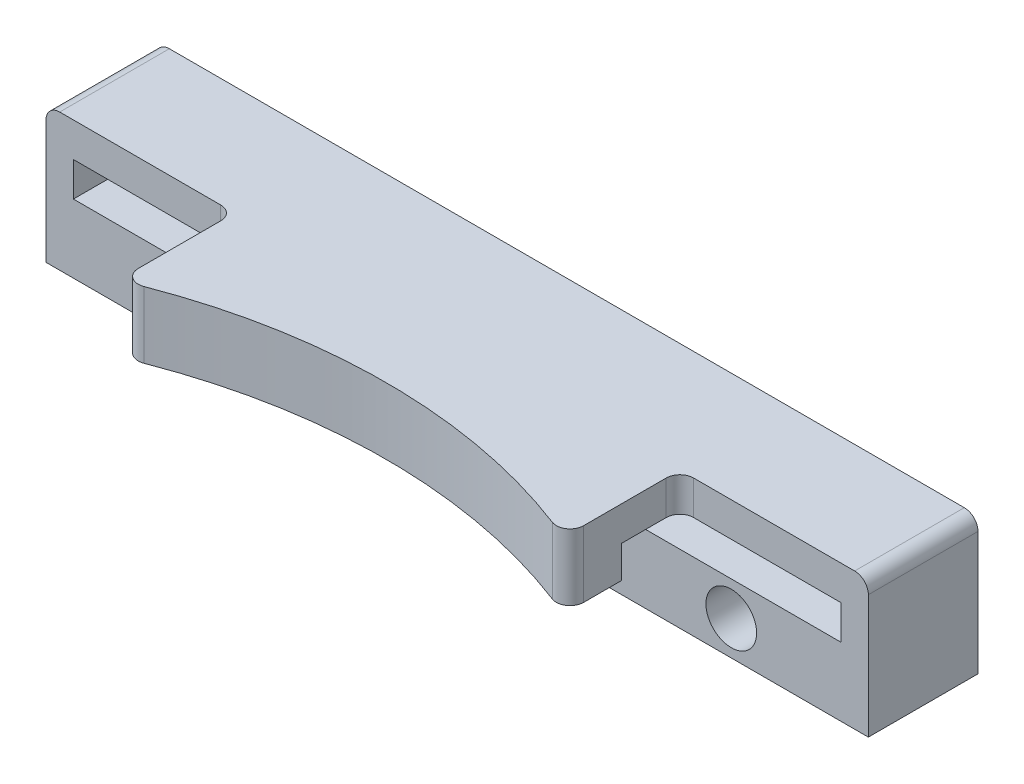
ISO-10303-21;
HEADER;
FILE_DESCRIPTION(('STEP AP214'),'2;1');
FILE_NAME('part.step','',(''),(''),'','','');
FILE_SCHEMA(('AUTOMOTIVE_DESIGN { 1 0 10303 214 1 1 1 1 }'));
ENDSEC;
DATA;
#1=APPLICATION_CONTEXT('core data for automotive mechanical design processes');
#2=APPLICATION_PROTOCOL_DEFINITION('international standard','automotive_design',2000,#1);
#3=PRODUCT_CONTEXT('',#1,'mechanical');
#4=PRODUCT('Part','Part','',(#3));
#5=PRODUCT_RELATED_PRODUCT_CATEGORY('part','',(#4));
#6=PRODUCT_DEFINITION_FORMATION('','',#4);
#7=PRODUCT_DEFINITION_CONTEXT('part definition',#1,'design');
#8=PRODUCT_DEFINITION('design','',#6,#7);
#9=PRODUCT_DEFINITION_SHAPE('','',#8);
#10=(LENGTH_UNIT() NAMED_UNIT(*) SI_UNIT(.MILLI.,.METRE.));
#11=(NAMED_UNIT(*) PLANE_ANGLE_UNIT() SI_UNIT($,.RADIAN.));
#12=(NAMED_UNIT(*) SI_UNIT($,.STERADIAN.) SOLID_ANGLE_UNIT());
#13=UNCERTAINTY_MEASURE_WITH_UNIT(LENGTH_MEASURE(1.E-05),#10,'distance_accuracy_value','');
#14=(GEOMETRIC_REPRESENTATION_CONTEXT(3) GLOBAL_UNCERTAINTY_ASSIGNED_CONTEXT((#13)) GLOBAL_UNIT_ASSIGNED_CONTEXT((#10,
#11,#12)) REPRESENTATION_CONTEXT('',''));
#15=CARTESIAN_POINT('',(0.,0.,0.));
#16=DIRECTION('',(0.,0.,1.));
#17=DIRECTION('',(1.,0.,0.));
#18=AXIS2_PLACEMENT_3D('',#15,#16,#17);
#19=CARTESIAN_POINT('',(-56.,15.,16.));
#20=DIRECTION('',(0.,-1.,0.));
#21=DIRECTION('',(0.,0.,-1.));
#22=AXIS2_PLACEMENT_3D('',#19,#20,#21);
#23=PLANE('',#22);
#24=DIRECTION('',(0.,0.,-1.));
#25=VECTOR('',#24,1.);
#26=CARTESIAN_POINT('',(32.5,15.,16.));
#27=LINE('',#26,#25);
#28=CARTESIAN_POINT('',(32.5,15.,24.52));
#29=VERTEX_POINT('',#28);
#30=CARTESIAN_POINT('',(32.5,15.,18.));
#31=VERTEX_POINT('',#30);
#32=EDGE_CURVE('E212',#29,#31,#27,.T.);
#33=ORIENTED_EDGE('',*,*,#32,.F.);
#34=CARTESIAN_POINT('',(0.,15.,100.892442674043));
#35=DIRECTION('',(0.,-1.,0.));
#36=DIRECTION('',(0.,0.,-1.));
#37=AXIS2_PLACEMENT_3D('',#34,#35,#36);
#38=CIRCLE('',#37,83.);
#39=CARTESIAN_POINT('',(-32.5,15.,24.52));
#40=VERTEX_POINT('',#39);
#41=EDGE_CURVE('E206',#40,#29,#38,.T.);
#42=ORIENTED_EDGE('',*,*,#41,.F.);
#43=DIRECTION('',(0.,0.,1.));
#44=VECTOR('',#43,1.);
#45=CARTESIAN_POINT('',(-32.5,15.,33.));
#46=LINE('',#45,#44);
#47=CARTESIAN_POINT('',(-32.5,15.,18.));
#48=VERTEX_POINT('',#47);
#49=EDGE_CURVE('E192',#48,#40,#46,.T.);
#50=ORIENTED_EDGE('',*,*,#49,.F.);
#51=CARTESIAN_POINT('',(-34.5,15.,18.));
#52=DIRECTION('',(0.,-1.,0.));
#53=DIRECTION('',(0.,0.,-1.));
#54=AXIS2_PLACEMENT_3D('',#51,#52,#53);
#55=CIRCLE('',#54,2.);
#56=CARTESIAN_POINT('',(-34.5,15.,16.));
#57=VERTEX_POINT('',#56);
#58=EDGE_CURVE('E11',#48,#57,#55,.F.);
#59=ORIENTED_EDGE('',*,*,#58,.T.);
#60=DIRECTION('',(-1.,0.,0.));
#61=VECTOR('',#60,1.);
#62=CARTESIAN_POINT('',(-56.,15.,16.));
#63=LINE('',#62,#61);
#64=CARTESIAN_POINT('',(-56.,15.,16.));
#65=VERTEX_POINT('',#64);
#66=EDGE_CURVE('E250',#57,#65,#63,.T.);
#67=ORIENTED_EDGE('',*,*,#66,.T.);
#68=DIRECTION('',(0.,0.,-1.));
#69=VECTOR('',#68,1.);
#70=CARTESIAN_POINT('',(-56.,15.,16.));
#71=LINE('',#70,#69);
#72=CARTESIAN_POINT('',(-56.,15.,0.));
#73=VERTEX_POINT('',#72);
#74=EDGE_CURVE('E254',#65,#73,#71,.T.);
#75=ORIENTED_EDGE('',*,*,#74,.T.);
#76=DIRECTION('',(-1.,0.,0.));
#77=VECTOR('',#76,1.);
#78=CARTESIAN_POINT('',(-56.,15.,0.));
#79=LINE('',#78,#77);
#80=CARTESIAN_POINT('',(56.,15.,0.));
#81=VERTEX_POINT('',#80);
#82=EDGE_CURVE('E245',#81,#73,#79,.T.);
#83=ORIENTED_EDGE('',*,*,#82,.F.);
#84=DIRECTION('',(0.,0.,-1.));
#85=VECTOR('',#84,1.);
#86=CARTESIAN_POINT('',(56.,15.,16.));
#87=LINE('',#86,#85);
#88=CARTESIAN_POINT('',(56.,15.,16.));
#89=VERTEX_POINT('',#88);
#90=EDGE_CURVE('E267',#89,#81,#87,.T.);
#91=ORIENTED_EDGE('',*,*,#90,.F.);
#92=CARTESIAN_POINT('',(34.5,15.,16.));
#93=VERTEX_POINT('',#92);
#94=EDGE_CURVE('E251',#89,#93,#63,.T.);
#95=ORIENTED_EDGE('',*,*,#94,.T.);
#96=CARTESIAN_POINT('',(34.5,15.,18.));
#97=DIRECTION('',(0.,-1.,0.));
#98=DIRECTION('',(0.,0.,-1.));
#99=AXIS2_PLACEMENT_3D('',#96,#97,#98);
#100=CIRCLE('',#99,2.);
#101=EDGE_CURVE('E349',#93,#31,#100,.F.);
#102=ORIENTED_EDGE('',*,*,#101,.T.);
#103=EDGE_LOOP('',(#33,#42,#50,#59,#67,#75,#83,#91,#95,#102));
#104=FACE_BOUND('',#103,.T.);
#105=ADVANCED_FACE('F38',(#104),#23,.T.);
#106=CARTESIAN_POINT('',(-40.,5.,16.));
#107=DIRECTION('',(0.,0.,-1.));
#108=DIRECTION('',(-1.,0.,0.));
#109=AXIS2_PLACEMENT_3D('',#106,#107,#108);
#110=CYLINDRICAL_SURFACE('',#109,2.);
#111=CARTESIAN_POINT('',(-40.,5.,0.));
#112=DIRECTION('',(0.,0.,1.));
#113=DIRECTION('',(1.,0.,0.));
#114=AXIS2_PLACEMENT_3D('',#111,#112,#113);
#115=CIRCLE('',#114,2.);
#116=CARTESIAN_POINT('',(-38.,5.,0.));
#117=VERTEX_POINT('',#116);
#118=EDGE_CURVE('E237',#117,#117,#115,.T.);
#119=ORIENTED_EDGE('',*,*,#118,.F.);
#120=EDGE_LOOP('',(#119));
#121=FACE_BOUND('',#120,.T.);
#122=CARTESIAN_POINT('',(-40.,5.,8.));
#123=DIRECTION('',(0.,0.,1.));
#124=DIRECTION('',(1.,0.,0.));
#125=AXIS2_PLACEMENT_3D('',#122,#123,#124);
#126=CIRCLE('',#125,2.);
#127=CARTESIAN_POINT('',(-38.,5.,8.));
#128=VERTEX_POINT('',#127);
#129=EDGE_CURVE('E238',#128,#128,#126,.T.);
#130=ORIENTED_EDGE('',*,*,#129,.T.);
#131=EDGE_LOOP('',(#130));
#132=FACE_BOUND('',#131,.T.);
#133=ADVANCED_FACE('F405',(#121,#132),#110,.F.);
#134=CARTESIAN_POINT('',(40.,5.,16.));
#135=DIRECTION('',(0.,0.,-1.));
#136=DIRECTION('',(-1.,0.,0.));
#137=AXIS2_PLACEMENT_3D('',#134,#135,#136);
#138=CYLINDRICAL_SURFACE('',#137,2.);
#139=CARTESIAN_POINT('',(40.,5.,0.));
#140=DIRECTION('',(0.,0.,1.));
#141=DIRECTION('',(1.,0.,0.));
#142=AXIS2_PLACEMENT_3D('',#139,#140,#141);
#143=CIRCLE('',#142,2.);
#144=CARTESIAN_POINT('',(42.,5.,0.));
#145=VERTEX_POINT('',#144);
#146=EDGE_CURVE('E234',#145,#145,#143,.T.);
#147=ORIENTED_EDGE('',*,*,#146,.F.);
#148=EDGE_LOOP('',(#147));
#149=FACE_BOUND('',#148,.T.);
#150=CARTESIAN_POINT('',(40.,5.,8.));
#151=DIRECTION('',(0.,0.,1.));
#152=DIRECTION('',(1.,0.,0.));
#153=AXIS2_PLACEMENT_3D('',#150,#151,#152);
#154=CIRCLE('',#153,2.);
#155=CARTESIAN_POINT('',(42.,5.,8.));
#156=VERTEX_POINT('',#155);
#157=EDGE_CURVE('E225',#156,#156,#154,.T.);
#158=ORIENTED_EDGE('',*,*,#157,.T.);
#159=EDGE_LOOP('',(#158));
#160=FACE_BOUND('',#159,.T.);
#161=ADVANCED_FACE('F412',(#149,#160),#138,.F.);
#162=CARTESIAN_POINT('',(0.,0.,16.));
#163=DIRECTION('',(0.,0.,1.));
#164=DIRECTION('',(1.,0.,0.));
#165=AXIS2_PLACEMENT_3D('',#162,#163,#164);
#166=PLANE('',#165);
#167=DIRECTION('',(-1.,0.,0.));
#168=VECTOR('',#167,1.);
#169=CARTESIAN_POINT('',(-60.,20.,16.));
#170=LINE('',#169,#168);
#171=CARTESIAN_POINT('',(-34.5,20.,16.));
#172=VERTEX_POINT('',#171);
#173=CARTESIAN_POINT('',(-58.,20.,16.));
#174=VERTEX_POINT('',#173);
#175=EDGE_CURVE('E283',#172,#174,#170,.T.);
#176=ORIENTED_EDGE('',*,*,#175,.T.);
#177=CARTESIAN_POINT('',(-58.,18.,16.));
#178=DIRECTION('',(0.,0.,1.));
#179=DIRECTION('',(1.,0.,0.));
#180=AXIS2_PLACEMENT_3D('',#177,#178,#179);
#181=CIRCLE('',#180,2.);
#182=CARTESIAN_POINT('',(-60.,18.,16.));
#183=VERTEX_POINT('',#182);
#184=EDGE_CURVE('E328',#174,#183,#181,.T.);
#185=ORIENTED_EDGE('',*,*,#184,.T.);
#186=DIRECTION('',(0.,-1.,0.));
#187=VECTOR('',#186,1.);
#188=CARTESIAN_POINT('',(-60.,20.,16.));
#189=LINE('',#188,#187);
#190=CARTESIAN_POINT('',(-60.,0.,16.));
#191=VERTEX_POINT('',#190);
#192=EDGE_CURVE('E275',#183,#191,#189,.T.);
#193=ORIENTED_EDGE('',*,*,#192,.T.);
#194=DIRECTION('',(1.,0.,0.));
#195=VECTOR('',#194,1.);
#196=CARTESIAN_POINT('',(-60.,0.,16.));
#197=LINE('',#196,#195);
#198=CARTESIAN_POINT('',(60.,0.,16.));
#199=VERTEX_POINT('',#198);
#200=EDGE_CURVE('E277',#191,#199,#197,.T.);
#201=ORIENTED_EDGE('',*,*,#200,.T.);
#202=DIRECTION('',(0.,1.,0.));
#203=VECTOR('',#202,1.);
#204=CARTESIAN_POINT('',(60.,20.,16.));
#205=LINE('',#204,#203);
#206=CARTESIAN_POINT('',(60.,18.,16.));
#207=VERTEX_POINT('',#206);
#208=EDGE_CURVE('E280',#199,#207,#205,.T.);
#209=ORIENTED_EDGE('',*,*,#208,.T.);
#210=CARTESIAN_POINT('',(58.,18.,16.));
#211=DIRECTION('',(0.,0.,1.));
#212=DIRECTION('',(1.,0.,0.));
#213=AXIS2_PLACEMENT_3D('',#210,#211,#212);
#214=CIRCLE('',#213,2.);
#215=CARTESIAN_POINT('',(58.,20.,16.));
#216=VERTEX_POINT('',#215);
#217=EDGE_CURVE('E326',#207,#216,#214,.T.);
#218=ORIENTED_EDGE('',*,*,#217,.T.);
#219=CARTESIAN_POINT('',(34.5,20.,16.));
#220=VERTEX_POINT('',#219);
#221=EDGE_CURVE('E284',#216,#220,#170,.T.);
#222=ORIENTED_EDGE('',*,*,#221,.T.);
#223=DIRECTION('',(0.,1.,0.));
#224=VECTOR('',#223,1.);
#225=CARTESIAN_POINT('',(34.5,15.,16.));
#226=LINE('',#225,#224);
#227=EDGE_CURVE('E324',#220,#93,#226,.F.);
#228=ORIENTED_EDGE('',*,*,#227,.T.);
#229=ORIENTED_EDGE('',*,*,#94,.F.);
#230=DIRECTION('',(0.,1.,0.));
#231=VECTOR('',#230,1.);
#232=CARTESIAN_POINT('',(56.,10.,16.));
#233=LINE('',#232,#231);
#234=CARTESIAN_POINT('',(56.,10.,16.));
#235=VERTEX_POINT('',#234);
#236=EDGE_CURVE('E247',#235,#89,#233,.T.);
#237=ORIENTED_EDGE('',*,*,#236,.F.);
#238=DIRECTION('',(1.,0.,0.));
#239=VECTOR('',#238,1.);
#240=CARTESIAN_POINT('',(-56.,10.,16.));
#241=LINE('',#240,#239);
#242=CARTESIAN_POINT('',(-56.,10.,16.));
#243=VERTEX_POINT('',#242);
#244=EDGE_CURVE('E244',#243,#235,#241,.T.);
#245=ORIENTED_EDGE('',*,*,#244,.F.);
#246=DIRECTION('',(0.,-1.,0.));
#247=VECTOR('',#246,1.);
#248=CARTESIAN_POINT('',(-56.,10.,16.));
#249=LINE('',#248,#247);
#250=EDGE_CURVE('E242',#65,#243,#249,.T.);
#251=ORIENTED_EDGE('',*,*,#250,.F.);
#252=ORIENTED_EDGE('',*,*,#66,.F.);
#253=DIRECTION('',(0.,1.,0.));
#254=VECTOR('',#253,1.);
#255=CARTESIAN_POINT('',(-34.5,20.,16.));
#256=LINE('',#255,#254);
#257=EDGE_CURVE('E321',#57,#172,#256,.T.);
#258=ORIENTED_EDGE('',*,*,#257,.T.);
#259=EDGE_LOOP('',(#176,#185,#193,#201,#209,#218,#222,#228,#229,#237,#245,#251,#252,#258));
#260=FACE_BOUND('',#259,.T.);
#261=CARTESIAN_POINT('',(-40.,5.,16.));
#262=DIRECTION('',(0.,0.,1.));
#263=DIRECTION('',(1.,0.,0.));
#264=AXIS2_PLACEMENT_3D('',#261,#262,#263);
#265=CIRCLE('',#264,3.7);
#266=CARTESIAN_POINT('',(-36.3,5.,16.));
#267=VERTEX_POINT('',#266);
#268=EDGE_CURVE('E226',#267,#267,#265,.T.);
#269=ORIENTED_EDGE('',*,*,#268,.F.);
#270=EDGE_LOOP('',(#269));
#271=FACE_BOUND('',#270,.T.);
#272=CARTESIAN_POINT('',(40.,5.,16.));
#273=DIRECTION('',(0.,0.,1.));
#274=DIRECTION('',(1.,0.,0.));
#275=AXIS2_PLACEMENT_3D('',#272,#273,#274);
#276=CIRCLE('',#275,3.7);
#277=CARTESIAN_POINT('',(43.7,5.,16.));
#278=VERTEX_POINT('',#277);
#279=EDGE_CURVE('E221',#278,#278,#276,.T.);
#280=ORIENTED_EDGE('',*,*,#279,.F.);
#281=EDGE_LOOP('',(#280));
#282=FACE_BOUND('',#281,.T.);
#283=ADVANCED_FACE('F365',(#260,#271,#282),#166,.T.);
#284=CARTESIAN_POINT('',(0.,0.,0.));
#285=DIRECTION('',(0.,0.,1.));
#286=DIRECTION('',(1.,0.,0.));
#287=AXIS2_PLACEMENT_3D('',#284,#285,#286);
#288=PLANE('',#287);
#289=DIRECTION('',(0.,-1.,0.));
#290=VECTOR('',#289,1.);
#291=CARTESIAN_POINT('',(-60.,20.,0.));
#292=LINE('',#291,#290);
#293=CARTESIAN_POINT('',(-60.,18.,0.));
#294=VERTEX_POINT('',#293);
#295=CARTESIAN_POINT('',(-60.,0.,0.));
#296=VERTEX_POINT('',#295);
#297=EDGE_CURVE('E274',#294,#296,#292,.T.);
#298=ORIENTED_EDGE('',*,*,#297,.F.);
#299=CARTESIAN_POINT('',(-58.,18.,0.));
#300=DIRECTION('',(0.,0.,1.));
#301=DIRECTION('',(1.,0.,0.));
#302=AXIS2_PLACEMENT_3D('',#299,#300,#301);
#303=CIRCLE('',#302,2.);
#304=CARTESIAN_POINT('',(-58.,20.,0.));
#305=VERTEX_POINT('',#304);
#306=EDGE_CURVE('E310',#294,#305,#303,.F.);
#307=ORIENTED_EDGE('',*,*,#306,.T.);
#308=DIRECTION('',(-1.,0.,0.));
#309=VECTOR('',#308,1.);
#310=CARTESIAN_POINT('',(-60.,20.,0.));
#311=LINE('',#310,#309);
#312=CARTESIAN_POINT('',(58.,20.,0.));
#313=VERTEX_POINT('',#312);
#314=EDGE_CURVE('E278',#313,#305,#311,.T.);
#315=ORIENTED_EDGE('',*,*,#314,.F.);
#316=CARTESIAN_POINT('',(58.,18.,0.));
#317=DIRECTION('',(0.,0.,1.));
#318=DIRECTION('',(1.,0.,0.));
#319=AXIS2_PLACEMENT_3D('',#316,#317,#318);
#320=CIRCLE('',#319,2.);
#321=CARTESIAN_POINT('',(60.,18.,0.));
#322=VERTEX_POINT('',#321);
#323=EDGE_CURVE('E308',#313,#322,#320,.F.);
#324=ORIENTED_EDGE('',*,*,#323,.T.);
#325=DIRECTION('',(0.,1.,0.));
#326=VECTOR('',#325,1.);
#327=CARTESIAN_POINT('',(60.,20.,0.));
#328=LINE('',#327,#326);
#329=CARTESIAN_POINT('',(60.,0.,0.));
#330=VERTEX_POINT('',#329);
#331=EDGE_CURVE('E291',#330,#322,#328,.T.);
#332=ORIENTED_EDGE('',*,*,#331,.F.);
#333=DIRECTION('',(1.,0.,0.));
#334=VECTOR('',#333,1.);
#335=CARTESIAN_POINT('',(-60.,0.,0.));
#336=LINE('',#335,#334);
#337=EDGE_CURVE('E289',#296,#330,#336,.T.);
#338=ORIENTED_EDGE('',*,*,#337,.F.);
#339=EDGE_LOOP('',(#298,#307,#315,#324,#332,#338));
#340=FACE_BOUND('',#339,.T.);
#341=DIRECTION('',(0.,-1.,0.));
#342=VECTOR('',#341,1.);
#343=CARTESIAN_POINT('',(-56.,10.,0.));
#344=LINE('',#343,#342);
#345=CARTESIAN_POINT('',(-56.,10.,0.));
#346=VERTEX_POINT('',#345);
#347=EDGE_CURVE('E241',#73,#346,#344,.T.);
#348=ORIENTED_EDGE('',*,*,#347,.T.);
#349=DIRECTION('',(1.,0.,0.));
#350=VECTOR('',#349,1.);
#351=CARTESIAN_POINT('',(-56.,10.,0.));
#352=LINE('',#351,#350);
#353=CARTESIAN_POINT('',(56.,10.,0.));
#354=VERTEX_POINT('',#353);
#355=EDGE_CURVE('E257',#346,#354,#352,.T.);
#356=ORIENTED_EDGE('',*,*,#355,.T.);
#357=DIRECTION('',(0.,1.,0.));
#358=VECTOR('',#357,1.);
#359=CARTESIAN_POINT('',(56.,10.,0.));
#360=LINE('',#359,#358);
#361=EDGE_CURVE('E260',#354,#81,#360,.T.);
#362=ORIENTED_EDGE('',*,*,#361,.T.);
#363=ORIENTED_EDGE('',*,*,#82,.T.);
#364=EDGE_LOOP('',(#348,#356,#362,#363));
#365=FACE_BOUND('',#364,.T.);
#366=ORIENTED_EDGE('',*,*,#118,.T.);
#367=EDGE_LOOP('',(#366));
#368=FACE_BOUND('',#367,.T.);
#369=ORIENTED_EDGE('',*,*,#146,.T.);
#370=EDGE_LOOP('',(#369));
#371=FACE_BOUND('',#370,.T.);
#372=ADVANCED_FACE('F377',(#340,#365,#368,#371),#288,.F.);
#373=CARTESIAN_POINT('',(-60.,20.,16.));
#374=DIRECTION('',(1.,0.,0.));
#375=DIRECTION('',(0.,1.,0.));
#376=AXIS2_PLACEMENT_3D('',#373,#374,#375);
#377=PLANE('',#376);
#378=ORIENTED_EDGE('',*,*,#192,.F.);
#379=DIRECTION('',(0.,0.,-1.));
#380=VECTOR('',#379,1.);
#381=CARTESIAN_POINT('',(-60.,18.,16.));
#382=LINE('',#381,#380);
#383=EDGE_CURVE('E301',#183,#294,#382,.T.);
#384=ORIENTED_EDGE('',*,*,#383,.T.);
#385=ORIENTED_EDGE('',*,*,#297,.T.);
#386=DIRECTION('',(0.,0.,-1.));
#387=VECTOR('',#386,1.);
#388=CARTESIAN_POINT('',(-60.,0.,16.));
#389=LINE('',#388,#387);
#390=EDGE_CURVE('E298',#191,#296,#389,.T.);
#391=ORIENTED_EDGE('',*,*,#390,.F.);
#392=EDGE_LOOP('',(#378,#384,#385,#391));
#393=FACE_BOUND('',#392,.T.);
#394=ADVANCED_FACE('F428',(#393),#377,.F.);
#395=CARTESIAN_POINT('',(-60.,0.,16.));
#396=DIRECTION('',(0.,1.,0.));
#397=DIRECTION('',(-1.,0.,0.));
#398=AXIS2_PLACEMENT_3D('',#395,#396,#397);
#399=PLANE('',#398);
#400=ORIENTED_EDGE('',*,*,#337,.T.);
#401=DIRECTION('',(0.,0.,-1.));
#402=VECTOR('',#401,1.);
#403=CARTESIAN_POINT('',(60.,0.,16.));
#404=LINE('',#403,#402);
#405=EDGE_CURVE('E287',#199,#330,#404,.T.);
#406=ORIENTED_EDGE('',*,*,#405,.F.);
#407=ORIENTED_EDGE('',*,*,#200,.F.);
#408=ORIENTED_EDGE('',*,*,#390,.T.);
#409=EDGE_LOOP('',(#400,#406,#407,#408));
#410=FACE_BOUND('',#409,.T.);
#411=ADVANCED_FACE('F434',(#410),#399,.F.);
#412=CARTESIAN_POINT('',(60.,20.,16.));
#413=DIRECTION('',(-1.,0.,0.));
#414=DIRECTION('',(0.,-1.,0.));
#415=AXIS2_PLACEMENT_3D('',#412,#413,#414);
#416=PLANE('',#415);
#417=ORIENTED_EDGE('',*,*,#331,.T.);
#418=DIRECTION('',(0.,0.,-1.));
#419=VECTOR('',#418,1.);
#420=CARTESIAN_POINT('',(60.,18.,16.));
#421=LINE('',#420,#419);
#422=EDGE_CURVE('E330',#322,#207,#421,.F.);
#423=ORIENTED_EDGE('',*,*,#422,.T.);
#424=ORIENTED_EDGE('',*,*,#208,.F.);
#425=ORIENTED_EDGE('',*,*,#405,.T.);
#426=EDGE_LOOP('',(#417,#423,#424,#425));
#427=FACE_BOUND('',#426,.T.);
#428=ADVANCED_FACE('F431',(#427),#416,.F.);
#429=CARTESIAN_POINT('',(-60.,20.,16.));
#430=DIRECTION('',(0.,-1.,0.));
#431=DIRECTION('',(1.,0.,0.));
#432=AXIS2_PLACEMENT_3D('',#429,#430,#431);
#433=PLANE('',#432);
#434=ORIENTED_EDGE('',*,*,#314,.T.);
#435=DIRECTION('',(0.,0.,-1.));
#436=VECTOR('',#435,1.);
#437=CARTESIAN_POINT('',(-58.,20.,16.));
#438=LINE('',#437,#436);
#439=EDGE_CURVE('E319',#305,#174,#438,.F.);
#440=ORIENTED_EDGE('',*,*,#439,.T.);
#441=ORIENTED_EDGE('',*,*,#175,.F.);
#442=CARTESIAN_POINT('',(-34.5,20.,18.));
#443=DIRECTION('',(0.,-1.,0.));
#444=DIRECTION('',(1.,0.,0.));
#445=AXIS2_PLACEMENT_3D('',#442,#443,#444);
#446=CIRCLE('',#445,2.);
#447=CARTESIAN_POINT('',(-32.5,20.,18.));
#448=VERTEX_POINT('',#447);
#449=EDGE_CURVE('E46',#172,#448,#446,.T.);
#450=ORIENTED_EDGE('',*,*,#449,.T.);
#451=DIRECTION('',(0.,0.,1.));
#452=VECTOR('',#451,1.);
#453=CARTESIAN_POINT('',(-32.5,20.,33.));
#454=LINE('',#453,#452);
#455=CARTESIAN_POINT('',(-32.5,20.,30.0329821263434));
#456=VERTEX_POINT('',#455);
#457=EDGE_CURVE('E209',#448,#456,#454,.T.);
#458=ORIENTED_EDGE('',*,*,#457,.T.);
#459=CARTESIAN_POINT('',(-30.5,20.,30.0329821263434));
#460=DIRECTION('',(0.,-1.,0.));
#461=DIRECTION('',(1.,0.,0.));
#462=AXIS2_PLACEMENT_3D('',#459,#460,#461);
#463=CIRCLE('',#462,2.);
#464=CARTESIAN_POINT('',(-29.7823529411765,20.,31.8997929627599));
#465=VERTEX_POINT('',#464);
#466=EDGE_CURVE('E314',#456,#465,#463,.F.);
#467=ORIENTED_EDGE('',*,*,#466,.T.);
#468=CARTESIAN_POINT('',(0.,20.,109.372442674043));
#469=DIRECTION('',(0.,-1.,0.));
#470=DIRECTION('',(1.,0.,0.));
#471=AXIS2_PLACEMENT_3D('',#468,#469,#470);
#472=CIRCLE('',#471,83.);
#473=CARTESIAN_POINT('',(29.7823529411765,20.,31.8997929627598));
#474=VERTEX_POINT('',#473);
#475=EDGE_CURVE('E195',#465,#474,#472,.T.);
#476=ORIENTED_EDGE('',*,*,#475,.T.);
#477=CARTESIAN_POINT('',(30.5,20.,30.0329821263434));
#478=DIRECTION('',(0.,-1.,0.));
#479=DIRECTION('',(1.,0.,0.));
#480=AXIS2_PLACEMENT_3D('',#477,#478,#479);
#481=CIRCLE('',#480,2.);
#482=CARTESIAN_POINT('',(32.5,20.,30.0329821263434));
#483=VERTEX_POINT('',#482);
#484=EDGE_CURVE('E312',#474,#483,#481,.F.);
#485=ORIENTED_EDGE('',*,*,#484,.T.);
#486=DIRECTION('',(0.,0.,-1.));
#487=VECTOR('',#486,1.);
#488=CARTESIAN_POINT('',(32.5,20.,16.));
#489=LINE('',#488,#487);
#490=CARTESIAN_POINT('',(32.5,20.,18.));
#491=VERTEX_POINT('',#490);
#492=EDGE_CURVE('E213',#483,#491,#489,.T.);
#493=ORIENTED_EDGE('',*,*,#492,.T.);
#494=CARTESIAN_POINT('',(34.5,20.,18.));
#495=DIRECTION('',(0.,-1.,0.));
#496=DIRECTION('',(1.,0.,0.));
#497=AXIS2_PLACEMENT_3D('',#494,#495,#496);
#498=CIRCLE('',#497,2.);
#499=EDGE_CURVE('E347',#491,#220,#498,.T.);
#500=ORIENTED_EDGE('',*,*,#499,.T.);
#501=ORIENTED_EDGE('',*,*,#221,.F.);
#502=DIRECTION('',(0.,0.,-1.));
#503=VECTOR('',#502,1.);
#504=CARTESIAN_POINT('',(58.,20.,16.));
#505=LINE('',#504,#503);
#506=EDGE_CURVE('E316',#216,#313,#505,.T.);
#507=ORIENTED_EDGE('',*,*,#506,.T.);
#508=EDGE_LOOP('',(#434,#440,#441,#450,#458,#467,#476,#485,#493,#500,#501,#507));
#509=FACE_BOUND('',#508,.T.);
#510=ADVANCED_FACE('F352',(#509),#433,.F.);
#511=CARTESIAN_POINT('',(-56.,10.,16.));
#512=DIRECTION('',(1.,0.,0.));
#513=DIRECTION('',(0.,0.,-1.));
#514=AXIS2_PLACEMENT_3D('',#511,#512,#513);
#515=PLANE('',#514);
#516=ORIENTED_EDGE('',*,*,#347,.F.);
#517=ORIENTED_EDGE('',*,*,#74,.F.);
#518=ORIENTED_EDGE('',*,*,#250,.T.);
#519=DIRECTION('',(0.,0.,-1.));
#520=VECTOR('',#519,1.);
#521=CARTESIAN_POINT('',(-56.,10.,16.));
#522=LINE('',#521,#520);
#523=EDGE_CURVE('E271',#243,#346,#522,.T.);
#524=ORIENTED_EDGE('',*,*,#523,.T.);
#525=EDGE_LOOP('',(#516,#517,#518,#524));
#526=FACE_BOUND('',#525,.T.);
#527=ADVANCED_FACE('F371',(#526),#515,.T.);
#528=CARTESIAN_POINT('',(-56.,10.,16.));
#529=DIRECTION('',(0.,1.,0.));
#530=DIRECTION('',(0.,0.,1.));
#531=AXIS2_PLACEMENT_3D('',#528,#529,#530);
#532=PLANE('',#531);
#533=ORIENTED_EDGE('',*,*,#355,.F.);
#534=ORIENTED_EDGE('',*,*,#523,.F.);
#535=ORIENTED_EDGE('',*,*,#244,.T.);
#536=DIRECTION('',(0.,0.,-1.));
#537=VECTOR('',#536,1.);
#538=CARTESIAN_POINT('',(56.,10.,16.));
#539=LINE('',#538,#537);
#540=EDGE_CURVE('E269',#235,#354,#539,.T.);
#541=ORIENTED_EDGE('',*,*,#540,.T.);
#542=EDGE_LOOP('',(#533,#534,#535,#541));
#543=FACE_BOUND('',#542,.T.);
#544=ADVANCED_FACE('F373',(#543),#532,.T.);
#545=CARTESIAN_POINT('',(56.,10.,16.));
#546=DIRECTION('',(-1.,0.,0.));
#547=DIRECTION('',(0.,-1.,0.));
#548=AXIS2_PLACEMENT_3D('',#545,#546,#547);
#549=PLANE('',#548);
#550=ORIENTED_EDGE('',*,*,#361,.F.);
#551=ORIENTED_EDGE('',*,*,#540,.F.);
#552=ORIENTED_EDGE('',*,*,#236,.T.);
#553=ORIENTED_EDGE('',*,*,#90,.T.);
#554=EDGE_LOOP('',(#550,#551,#552,#553));
#555=FACE_BOUND('',#554,.T.);
#556=ADVANCED_FACE('F383',(#555),#549,.T.);
#557=CARTESIAN_POINT('',(40.,5.,8.));
#558=DIRECTION('',(0.,0.,1.));
#559=DIRECTION('',(1.,0.,0.));
#560=AXIS2_PLACEMENT_3D('',#557,#558,#559);
#561=CYLINDRICAL_SURFACE('',#560,3.7);
#562=CARTESIAN_POINT('',(40.,5.,8.));
#563=DIRECTION('',(0.,0.,1.));
#564=DIRECTION('',(1.,0.,0.));
#565=AXIS2_PLACEMENT_3D('',#562,#563,#564);
#566=CIRCLE('',#565,3.7);
#567=CARTESIAN_POINT('',(43.7,5.,8.));
#568=VERTEX_POINT('',#567);
#569=EDGE_CURVE('E229',#568,#568,#566,.T.);
#570=ORIENTED_EDGE('',*,*,#569,.F.);
#571=EDGE_LOOP('',(#570));
#572=FACE_BOUND('',#571,.T.);
#573=ORIENTED_EDGE('',*,*,#279,.T.);
#574=EDGE_LOOP('',(#573));
#575=FACE_BOUND('',#574,.T.);
#576=ADVANCED_FACE('F419',(#572,#575),#561,.F.);
#577=CARTESIAN_POINT('',(40.,5.,8.));
#578=DIRECTION('',(0.,0.,1.));
#579=DIRECTION('',(1.,0.,0.));
#580=AXIS2_PLACEMENT_3D('',#577,#578,#579);
#581=PLANE('',#580);
#582=ORIENTED_EDGE('',*,*,#157,.F.);
#583=EDGE_LOOP('',(#582));
#584=FACE_BOUND('',#583,.T.);
#585=ORIENTED_EDGE('',*,*,#569,.T.);
#586=EDGE_LOOP('',(#585));
#587=FACE_BOUND('',#586,.T.);
#588=ADVANCED_FACE('F582',(#584,#587),#581,.T.);
#589=CARTESIAN_POINT('',(-40.,5.,8.));
#590=DIRECTION('',(0.,0.,1.));
#591=DIRECTION('',(1.,0.,0.));
#592=AXIS2_PLACEMENT_3D('',#589,#590,#591);
#593=CYLINDRICAL_SURFACE('',#592,3.7);
#594=CARTESIAN_POINT('',(-40.,5.,8.));
#595=DIRECTION('',(0.,0.,1.));
#596=DIRECTION('',(1.,0.,0.));
#597=AXIS2_PLACEMENT_3D('',#594,#595,#596);
#598=CIRCLE('',#597,3.7);
#599=CARTESIAN_POINT('',(-36.3,5.,8.));
#600=VERTEX_POINT('',#599);
#601=EDGE_CURVE('E222',#600,#600,#598,.T.);
#602=ORIENTED_EDGE('',*,*,#601,.F.);
#603=EDGE_LOOP('',(#602));
#604=FACE_BOUND('',#603,.T.);
#605=ORIENTED_EDGE('',*,*,#268,.T.);
#606=EDGE_LOOP('',(#605));
#607=FACE_BOUND('',#606,.T.);
#608=ADVANCED_FACE('F573',(#604,#607),#593,.F.);
#609=CARTESIAN_POINT('',(-40.,5.,8.));
#610=DIRECTION('',(0.,0.,1.));
#611=DIRECTION('',(1.,0.,0.));
#612=AXIS2_PLACEMENT_3D('',#609,#610,#611);
#613=PLANE('',#612);
#614=ORIENTED_EDGE('',*,*,#129,.F.);
#615=EDGE_LOOP('',(#614));
#616=FACE_BOUND('',#615,.T.);
#617=ORIENTED_EDGE('',*,*,#601,.T.);
#618=EDGE_LOOP('',(#617));
#619=FACE_BOUND('',#618,.T.);
#620=ADVANCED_FACE('F527',(#616,#619),#613,.T.);
#621=CARTESIAN_POINT('',(32.5,-52.1863081289633,16.));
#622=DIRECTION('',(1.,0.,0.));
#623=DIRECTION('',(0.,0.,-1.));
#624=AXIS2_PLACEMENT_3D('',#621,#622,#623);
#625=PLANE('',#624);
#626=ORIENTED_EDGE('',*,*,#32,.T.);
#627=DIRECTION('',(0.,1.,0.));
#628=VECTOR('',#627,1.);
#629=CARTESIAN_POINT('',(32.5,20.,18.));
#630=LINE('',#629,#628);
#631=EDGE_CURVE('E334',#31,#491,#630,.T.);
#632=ORIENTED_EDGE('',*,*,#631,.T.);
#633=ORIENTED_EDGE('',*,*,#492,.F.);
#634=DIRECTION('',(0.,1.,0.));
#635=VECTOR('',#634,1.);
#636=CARTESIAN_POINT('',(32.5,-52.1863081289633,30.0329821263434));
#637=LINE('',#636,#635);
#638=CARTESIAN_POINT('',(32.5,10.3,30.0329821263434));
#639=VERTEX_POINT('',#638);
#640=EDGE_CURVE('E332',#483,#639,#637,.F.);
#641=ORIENTED_EDGE('',*,*,#640,.T.);
#642=DIRECTION('',(0.,0.,1.));
#643=VECTOR('',#642,1.);
#644=CARTESIAN_POINT('',(32.5,10.3,24.52));
#645=LINE('',#644,#643);
#646=CARTESIAN_POINT('',(32.5,10.3,24.52));
#647=VERTEX_POINT('',#646);
#648=EDGE_CURVE('E201',#647,#639,#645,.T.);
#649=ORIENTED_EDGE('',*,*,#648,.F.);
#650=DIRECTION('',(0.,1.,0.));
#651=VECTOR('',#650,1.);
#652=CARTESIAN_POINT('',(32.5,10.3,24.52));
#653=LINE('',#652,#651);
#654=EDGE_CURVE('E196',#647,#29,#653,.T.);
#655=ORIENTED_EDGE('',*,*,#654,.T.);
#656=EDGE_LOOP('',(#626,#632,#633,#641,#649,#655));
#657=FACE_BOUND('',#656,.T.);
#658=ADVANCED_FACE('F390',(#657),#625,.T.);
#659=CARTESIAN_POINT('',(-32.5,-52.1863081289633,33.));
#660=DIRECTION('',(-1.,0.,0.));
#661=DIRECTION('',(0.,-1.,0.));
#662=AXIS2_PLACEMENT_3D('',#659,#660,#661);
#663=PLANE('',#662);
#664=ORIENTED_EDGE('',*,*,#457,.F.);
#665=DIRECTION('',(0.,1.,0.));
#666=VECTOR('',#665,1.);
#667=CARTESIAN_POINT('',(-32.5,15.,18.));
#668=LINE('',#667,#666);
#669=EDGE_CURVE('E339',#448,#48,#668,.F.);
#670=ORIENTED_EDGE('',*,*,#669,.T.);
#671=ORIENTED_EDGE('',*,*,#49,.T.);
#672=DIRECTION('',(0.,1.,0.));
#673=VECTOR('',#672,1.);
#674=CARTESIAN_POINT('',(-32.5,10.3,24.52));
#675=LINE('',#674,#673);
#676=CARTESIAN_POINT('',(-32.5,10.3,24.52));
#677=VERTEX_POINT('',#676);
#678=EDGE_CURVE('E188',#677,#40,#675,.T.);
#679=ORIENTED_EDGE('',*,*,#678,.F.);
#680=DIRECTION('',(0.,0.,-1.));
#681=VECTOR('',#680,1.);
#682=CARTESIAN_POINT('',(-32.5,10.3,24.52));
#683=LINE('',#682,#681);
#684=CARTESIAN_POINT('',(-32.5,10.3,30.0329821263434));
#685=VERTEX_POINT('',#684);
#686=EDGE_CURVE('E174',#685,#677,#683,.T.);
#687=ORIENTED_EDGE('',*,*,#686,.F.);
#688=DIRECTION('',(0.,1.,0.));
#689=VECTOR('',#688,1.);
#690=CARTESIAN_POINT('',(-32.5,-52.1863081289633,30.0329821263434));
#691=LINE('',#690,#689);
#692=EDGE_CURVE('E337',#685,#456,#691,.T.);
#693=ORIENTED_EDGE('',*,*,#692,.T.);
#694=EDGE_LOOP('',(#664,#670,#671,#679,#687,#693));
#695=FACE_BOUND('',#694,.T.);
#696=ADVANCED_FACE('F190',(#695),#663,.T.);
#697=CARTESIAN_POINT('',(0.,-52.1863081289633,109.372442674043));
#698=DIRECTION('',(0.,1.,0.));
#699=DIRECTION('',(-1.,0.,0.));
#700=AXIS2_PLACEMENT_3D('',#697,#698,#699);
#701=CYLINDRICAL_SURFACE('',#700,83.);
#702=ORIENTED_EDGE('',*,*,#475,.F.);
#703=DIRECTION('',(0.,1.,0.));
#704=VECTOR('',#703,1.);
#705=CARTESIAN_POINT('',(-29.7823529411765,-52.1863081289633,31.8997929627598));
#706=LINE('',#705,#704);
#707=CARTESIAN_POINT('',(-29.7823529411765,10.3,31.8997929627599));
#708=VERTEX_POINT('',#707);
#709=EDGE_CURVE('E53',#465,#708,#706,.F.);
#710=ORIENTED_EDGE('',*,*,#709,.T.);
#711=CARTESIAN_POINT('',(0.,10.3,109.372442674043));
#712=DIRECTION('',(0.,1.,0.));
#713=DIRECTION('',(0.,0.,-1.));
#714=AXIS2_PLACEMENT_3D('',#711,#712,#713);
#715=CIRCLE('',#714,83.);
#716=CARTESIAN_POINT('',(29.7823529411765,10.3,31.8997929627598));
#717=VERTEX_POINT('',#716);
#718=EDGE_CURVE('E185',#717,#708,#715,.T.);
#719=ORIENTED_EDGE('',*,*,#718,.F.);
#720=DIRECTION('',(0.,1.,0.));
#721=VECTOR('',#720,1.);
#722=CARTESIAN_POINT('',(29.7823529411765,-52.1863081289633,31.8997929627598));
#723=LINE('',#722,#721);
#724=EDGE_CURVE('E341',#717,#474,#723,.T.);
#725=ORIENTED_EDGE('',*,*,#724,.T.);
#726=EDGE_LOOP('',(#702,#710,#719,#725));
#727=FACE_BOUND('',#726,.T.);
#728=ADVANCED_FACE('F395',(#727),#701,.F.);
#729=CARTESIAN_POINT('',(0.,10.3,100.892442674043));
#730=DIRECTION('',(0.,1.,0.));
#731=DIRECTION('',(0.,0.,1.));
#732=AXIS2_PLACEMENT_3D('',#729,#730,#731);
#733=CYLINDRICAL_SURFACE('',#732,83.);
#734=ORIENTED_EDGE('',*,*,#41,.T.);
#735=ORIENTED_EDGE('',*,*,#654,.F.);
#736=CARTESIAN_POINT('',(0.,10.3,100.892442674043));
#737=DIRECTION('',(0.,-1.,0.));
#738=DIRECTION('',(0.,0.,-1.));
#739=AXIS2_PLACEMENT_3D('',#736,#737,#738);
#740=CIRCLE('',#739,83.);
#741=EDGE_CURVE('E178',#677,#647,#740,.T.);
#742=ORIENTED_EDGE('',*,*,#741,.F.);
#743=ORIENTED_EDGE('',*,*,#678,.T.);
#744=EDGE_LOOP('',(#734,#735,#742,#743));
#745=FACE_BOUND('',#744,.T.);
#746=ADVANCED_FACE('F198',(#745),#733,.T.);
#747=CARTESIAN_POINT('',(0.,10.3,109.372442674043));
#748=DIRECTION('',(0.,-1.,0.));
#749=DIRECTION('',(0.,0.,-1.));
#750=AXIS2_PLACEMENT_3D('',#747,#748,#749);
#751=PLANE('',#750);
#752=ORIENTED_EDGE('',*,*,#718,.T.);
#753=CARTESIAN_POINT('',(-30.5,10.3,30.0329821263434));
#754=DIRECTION('',(0.,-1.,0.));
#755=DIRECTION('',(0.,0.,-1.));
#756=AXIS2_PLACEMENT_3D('',#753,#754,#755);
#757=CIRCLE('',#756,2.);
#758=EDGE_CURVE('E181',#708,#685,#757,.T.);
#759=ORIENTED_EDGE('',*,*,#758,.T.);
#760=ORIENTED_EDGE('',*,*,#686,.T.);
#761=ORIENTED_EDGE('',*,*,#741,.T.);
#762=ORIENTED_EDGE('',*,*,#648,.T.);
#763=CARTESIAN_POINT('',(30.5,10.3,30.0329821263434));
#764=DIRECTION('',(0.,-1.,0.));
#765=DIRECTION('',(0.,0.,-1.));
#766=AXIS2_PLACEMENT_3D('',#763,#764,#765);
#767=CIRCLE('',#766,2.);
#768=EDGE_CURVE('E60',#639,#717,#767,.T.);
#769=ORIENTED_EDGE('',*,*,#768,.T.);
#770=EDGE_LOOP('',(#752,#759,#760,#761,#762,#769));
#771=FACE_BOUND('',#770,.T.);
#772=ADVANCED_FACE('F176',(#771),#751,.T.);
#773=CARTESIAN_POINT('',(-58.,18.,16.));
#774=DIRECTION('',(0.,0.,-1.));
#775=DIRECTION('',(-1.,0.,0.));
#776=AXIS2_PLACEMENT_3D('',#773,#774,#775);
#777=CYLINDRICAL_SURFACE('',#776,2.);
#778=ORIENTED_EDGE('',*,*,#184,.F.);
#779=ORIENTED_EDGE('',*,*,#439,.F.);
#780=ORIENTED_EDGE('',*,*,#306,.F.);
#781=ORIENTED_EDGE('',*,*,#383,.F.);
#782=EDGE_LOOP('',(#778,#779,#780,#781));
#783=FACE_BOUND('',#782,.T.);
#784=ADVANCED_FACE('F442',(#783),#777,.T.);
#785=CARTESIAN_POINT('',(58.,18.,16.));
#786=DIRECTION('',(0.,0.,-1.));
#787=DIRECTION('',(-1.,0.,0.));
#788=AXIS2_PLACEMENT_3D('',#785,#786,#787);
#789=CYLINDRICAL_SURFACE('',#788,2.);
#790=ORIENTED_EDGE('',*,*,#217,.F.);
#791=ORIENTED_EDGE('',*,*,#422,.F.);
#792=ORIENTED_EDGE('',*,*,#323,.F.);
#793=ORIENTED_EDGE('',*,*,#506,.F.);
#794=EDGE_LOOP('',(#790,#791,#792,#793));
#795=FACE_BOUND('',#794,.T.);
#796=ADVANCED_FACE('F445',(#795),#789,.T.);
#797=CARTESIAN_POINT('',(34.5,-52.1863081289633,18.));
#798=DIRECTION('',(0.,-1.,0.));
#799=DIRECTION('',(1.,0.,0.));
#800=AXIS2_PLACEMENT_3D('',#797,#798,#799);
#801=CYLINDRICAL_SURFACE('',#800,2.);
#802=ORIENTED_EDGE('',*,*,#101,.F.);
#803=ORIENTED_EDGE('',*,*,#227,.F.);
#804=ORIENTED_EDGE('',*,*,#499,.F.);
#805=ORIENTED_EDGE('',*,*,#631,.F.);
#806=EDGE_LOOP('',(#802,#803,#804,#805));
#807=FACE_BOUND('',#806,.T.);
#808=ADVANCED_FACE('F387',(#807),#801,.F.);
#809=CARTESIAN_POINT('',(-34.5,0.,18.));
#810=DIRECTION('',(0.,-1.,0.));
#811=DIRECTION('',(1.,0.,0.));
#812=AXIS2_PLACEMENT_3D('',#809,#810,#811);
#813=CYLINDRICAL_SURFACE('',#812,2.);
#814=ORIENTED_EDGE('',*,*,#58,.F.);
#815=ORIENTED_EDGE('',*,*,#669,.F.);
#816=ORIENTED_EDGE('',*,*,#449,.F.);
#817=ORIENTED_EDGE('',*,*,#257,.F.);
#818=EDGE_LOOP('',(#814,#815,#816,#817));
#819=FACE_BOUND('',#818,.T.);
#820=ADVANCED_FACE('F358',(#819),#813,.F.);
#821=CARTESIAN_POINT('',(-30.5,-52.1863081289633,30.0329821263434));
#822=DIRECTION('',(0.,1.,0.));
#823=DIRECTION('',(-1.,0.,0.));
#824=AXIS2_PLACEMENT_3D('',#821,#822,#823);
#825=CYLINDRICAL_SURFACE('',#824,2.);
#826=ORIENTED_EDGE('',*,*,#758,.F.);
#827=ORIENTED_EDGE('',*,*,#709,.F.);
#828=ORIENTED_EDGE('',*,*,#466,.F.);
#829=ORIENTED_EDGE('',*,*,#692,.F.);
#830=EDGE_LOOP('',(#826,#827,#828,#829));
#831=FACE_BOUND('',#830,.T.);
#832=ADVANCED_FACE('F397',(#831),#825,.T.);
#833=CARTESIAN_POINT('',(30.5,-52.1863081289633,30.0329821263434));
#834=DIRECTION('',(0.,1.,0.));
#835=DIRECTION('',(-1.,0.,0.));
#836=AXIS2_PLACEMENT_3D('',#833,#834,#835);
#837=CYLINDRICAL_SURFACE('',#836,2.);
#838=ORIENTED_EDGE('',*,*,#768,.F.);
#839=ORIENTED_EDGE('',*,*,#640,.F.);
#840=ORIENTED_EDGE('',*,*,#484,.F.);
#841=ORIENTED_EDGE('',*,*,#724,.F.);
#842=EDGE_LOOP('',(#838,#839,#840,#841));
#843=FACE_BOUND('',#842,.T.);
#844=ADVANCED_FACE('F40',(#843),#837,.T.);
#845=CLOSED_SHELL('',(#105,#133,#161,#283,#372,#394,#411,#428,#510,#527,#544,#556,#576,#588,
#608,#620,#658,#696,#728,#746,#772,#784,#796,#808,#820,#832,#844));
#846=MANIFOLD_SOLID_BREP('B2',#845);
#847=ADVANCED_BREP_SHAPE_REPRESENTATION('',(#18,#846),#14);
#848=SHAPE_DEFINITION_REPRESENTATION(#9,#847);
ENDSEC;
END-ISO-10303-21;
